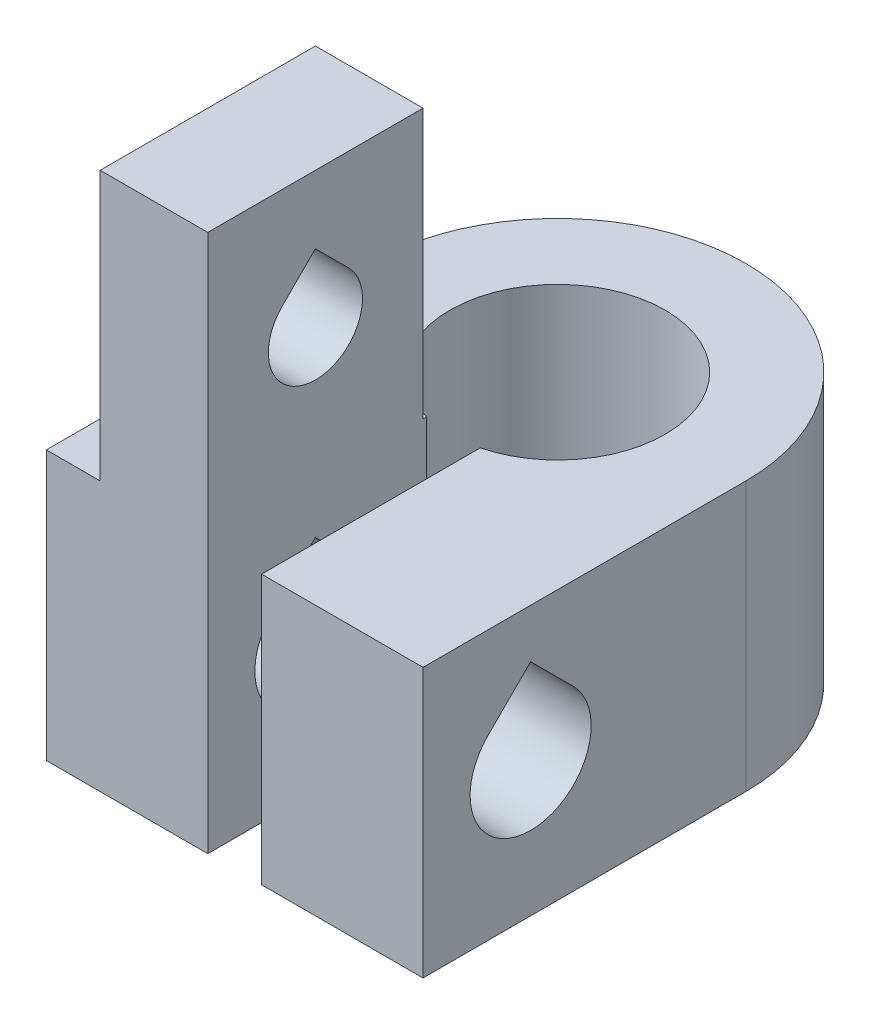
ISO-10303-21;
HEADER;
FILE_DESCRIPTION(('STEP AP214'),'2;1');
FILE_NAME('part.step','',(''),(''),'','','');
FILE_SCHEMA(('AUTOMOTIVE_DESIGN { 1 0 10303 214 1 1 1 1 }'));
ENDSEC;
DATA;
#1=APPLICATION_CONTEXT('core data for automotive mechanical design processes');
#2=APPLICATION_PROTOCOL_DEFINITION('international standard','automotive_design',2000,#1);
#3=PRODUCT_CONTEXT('',#1,'mechanical');
#4=PRODUCT('Part','Part','',(#3));
#5=PRODUCT_RELATED_PRODUCT_CATEGORY('part','',(#4));
#6=PRODUCT_DEFINITION_FORMATION('','',#4);
#7=PRODUCT_DEFINITION_CONTEXT('part definition',#1,'design');
#8=PRODUCT_DEFINITION('design','',#6,#7);
#9=PRODUCT_DEFINITION_SHAPE('','',#8);
#10=(LENGTH_UNIT() NAMED_UNIT(*) SI_UNIT(.MILLI.,.METRE.));
#11=(NAMED_UNIT(*) PLANE_ANGLE_UNIT() SI_UNIT($,.RADIAN.));
#12=(NAMED_UNIT(*) SI_UNIT($,.STERADIAN.) SOLID_ANGLE_UNIT());
#13=UNCERTAINTY_MEASURE_WITH_UNIT(LENGTH_MEASURE(1.E-05),#10,'distance_accuracy_value','');
#14=(GEOMETRIC_REPRESENTATION_CONTEXT(3) GLOBAL_UNCERTAINTY_ASSIGNED_CONTEXT((#13)) GLOBAL_UNIT_ASSIGNED_CONTEXT((#10,
#11,#12)) REPRESENTATION_CONTEXT('',''));
#15=CARTESIAN_POINT('',(0.,0.,0.));
#16=DIRECTION('',(0.,0.,1.));
#17=DIRECTION('',(1.,0.,0.));
#18=AXIS2_PLACEMENT_3D('',#15,#16,#17);
#19=CARTESIAN_POINT('',(-7.,20.,12.));
#20=DIRECTION('',(0.,0.,-1.));
#21=DIRECTION('',(-1.,0.,0.));
#22=AXIS2_PLACEMENT_3D('',#19,#20,#21);
#23=PLANE('',#22);
#24=DIRECTION('',(0.,1.,0.));
#25=VECTOR('',#24,1.);
#26=CARTESIAN_POINT('',(-5.,10.,12.));
#27=LINE('',#26,#25);
#28=CARTESIAN_POINT('',(-5.,10.,12.));
#29=VERTEX_POINT('',#28);
#30=CARTESIAN_POINT('',(-5.,20.,12.));
#31=VERTEX_POINT('',#30);
#32=EDGE_CURVE('E175',#29,#31,#27,.T.);
#33=ORIENTED_EDGE('',*,*,#32,.F.);
#34=DIRECTION('',(-1.,0.,0.));
#35=VECTOR('',#34,1.);
#36=CARTESIAN_POINT('',(-5.,10.,12.));
#37=LINE('',#36,#35);
#38=CARTESIAN_POINT('',(-7.,10.,12.));
#39=VERTEX_POINT('',#38);
#40=EDGE_CURVE('E173',#29,#39,#37,.T.);
#41=ORIENTED_EDGE('',*,*,#40,.T.);
#42=DIRECTION('',(0.,-1.,0.));
#43=VECTOR('',#42,1.);
#44=CARTESIAN_POINT('',(-7.,20.,12.));
#45=LINE('',#44,#43);
#46=CARTESIAN_POINT('',(-7.,0.,12.));
#47=VERTEX_POINT('',#46);
#48=EDGE_CURVE('E261',#39,#47,#45,.T.);
#49=ORIENTED_EDGE('',*,*,#48,.T.);
#50=DIRECTION('',(1.,0.,0.));
#51=VECTOR('',#50,1.);
#52=CARTESIAN_POINT('',(-7.,0.,12.));
#53=LINE('',#52,#51);
#54=CARTESIAN_POINT('',(-1.,0.,12.));
#55=VERTEX_POINT('',#54);
#56=EDGE_CURVE('E254',#47,#55,#53,.T.);
#57=ORIENTED_EDGE('',*,*,#56,.T.);
#58=DIRECTION('',(0.,-1.,0.));
#59=VECTOR('',#58,1.);
#60=CARTESIAN_POINT('',(-1.,20.,12.));
#61=LINE('',#60,#59);
#62=CARTESIAN_POINT('',(-1.,20.,12.));
#63=VERTEX_POINT('',#62);
#64=EDGE_CURVE('E39',#63,#55,#61,.T.);
#65=ORIENTED_EDGE('',*,*,#64,.F.);
#66=DIRECTION('',(1.,0.,0.));
#67=VECTOR('',#66,1.);
#68=CARTESIAN_POINT('',(-7.,20.,12.));
#69=LINE('',#68,#67);
#70=EDGE_CURVE('E255',#31,#63,#69,.T.);
#71=ORIENTED_EDGE('',*,*,#70,.F.);
#72=EDGE_LOOP('',(#33,#41,#49,#57,#65,#71));
#73=FACE_BOUND('',#72,.T.);
#74=ADVANCED_FACE('F32',(#73),#23,.F.);
#75=CARTESIAN_POINT('',(-1.,20.,12.));
#76=DIRECTION('',(-1.,0.,0.));
#77=DIRECTION('',(0.,0.,1.));
#78=AXIS2_PLACEMENT_3D('',#75,#76,#77);
#79=PLANE('',#78);
#80=DIRECTION('',(0.,0.707106781186548,0.707106781186547));
#81=VECTOR('',#80,1.);
#82=CARTESIAN_POINT('',(-1.,17.4748737341529,8.));
#83=LINE('',#82,#81);
#84=CARTESIAN_POINT('',(-1.,16.2374368670765,6.76256313292354));
#85=VERTEX_POINT('',#84);
#86=CARTESIAN_POINT('',(-1.,17.4748737341529,8.));
#87=VERTEX_POINT('',#86);
#88=EDGE_CURVE('E338',#85,#87,#83,.T.);
#89=ORIENTED_EDGE('',*,*,#88,.F.);
#90=CARTESIAN_POINT('',(-1.,15.,8.));
#91=DIRECTION('',(1.,0.,0.));
#92=DIRECTION('',(0.,0.,-1.));
#93=AXIS2_PLACEMENT_3D('',#90,#91,#92);
#94=CIRCLE('',#93,1.75);
#95=CARTESIAN_POINT('',(-1.,16.2374368670765,9.23743686707646));
#96=VERTEX_POINT('',#95);
#97=EDGE_CURVE('E341',#96,#85,#94,.T.);
#98=ORIENTED_EDGE('',*,*,#97,.F.);
#99=DIRECTION('',(0.,-0.707106781186547,0.707106781186548));
#100=VECTOR('',#99,1.);
#101=CARTESIAN_POINT('',(-1.,16.2374368670765,9.23743686707646));
#102=LINE('',#101,#100);
#103=EDGE_CURVE('E333',#87,#96,#102,.T.);
#104=ORIENTED_EDGE('',*,*,#103,.F.);
#105=EDGE_LOOP('',(#89,#98,#104));
#106=FACE_BOUND('',#105,.T.);
#107=DIRECTION('',(0.,-0.707106781186548,-0.707106781186547));
#108=VECTOR('',#107,1.);
#109=CARTESIAN_POINT('',(-1.,16.0909902576697,15.9090097423303));
#110=LINE('',#109,#108);
#111=CARTESIAN_POINT('',(-1.,8.18198051533946,8.));
#112=VERTEX_POINT('',#111);
#113=CARTESIAN_POINT('',(-1.,6.59099025766973,6.40900974233027));
#114=VERTEX_POINT('',#113);
#115=EDGE_CURVE('E245',#112,#114,#110,.T.);
#116=ORIENTED_EDGE('',*,*,#115,.T.);
#117=CARTESIAN_POINT('',(-1.,5.,8.));
#118=DIRECTION('',(-1.,0.,0.));
#119=DIRECTION('',(0.,0.,1.));
#120=AXIS2_PLACEMENT_3D('',#117,#118,#119);
#121=CIRCLE('',#120,2.25);
#122=CARTESIAN_POINT('',(-1.,6.59099025766973,9.59099025766973));
#123=VERTEX_POINT('',#122);
#124=EDGE_CURVE('E251',#114,#123,#121,.T.);
#125=ORIENTED_EDGE('',*,*,#124,.T.);
#126=DIRECTION('',(0.,0.707106781186548,-0.707106781186547));
#127=VECTOR('',#126,1.);
#128=CARTESIAN_POINT('',(-1.,12.0909902576697,4.09099025766973));
#129=LINE('',#128,#127);
#130=EDGE_CURVE('E239',#123,#112,#129,.T.);
#131=ORIENTED_EDGE('',*,*,#130,.T.);
#132=EDGE_LOOP('',(#116,#125,#131));
#133=FACE_BOUND('',#132,.T.);
#134=DIRECTION('',(0.,0.,1.));
#135=VECTOR('',#134,1.);
#136=CARTESIAN_POINT('',(-1.,10.,12.));
#137=LINE('',#136,#135);
#138=CARTESIAN_POINT('',(-1.,10.,3.87298334620742));
#139=VERTEX_POINT('',#138);
#140=CARTESIAN_POINT('',(-1.,10.,4.));
#141=VERTEX_POINT('',#140);
#142=EDGE_CURVE('E206',#139,#141,#137,.T.);
#143=ORIENTED_EDGE('',*,*,#142,.T.);
#144=DIRECTION('',(0.,1.,0.));
#145=VECTOR('',#144,1.);
#146=CARTESIAN_POINT('',(-1.,20.,4.));
#147=LINE('',#146,#145);
#148=CARTESIAN_POINT('',(-1.,20.,4.));
#149=VERTEX_POINT('',#148);
#150=EDGE_CURVE('E184',#141,#149,#147,.T.);
#151=ORIENTED_EDGE('',*,*,#150,.T.);
#152=DIRECTION('',(0.,0.,-1.));
#153=VECTOR('',#152,1.);
#154=CARTESIAN_POINT('',(-1.,20.,12.));
#155=LINE('',#154,#153);
#156=EDGE_CURVE('E257',#63,#149,#155,.T.);
#157=ORIENTED_EDGE('',*,*,#156,.F.);
#158=ORIENTED_EDGE('',*,*,#64,.T.);
#159=DIRECTION('',(0.,0.,-1.));
#160=VECTOR('',#159,1.);
#161=CARTESIAN_POINT('',(-1.,0.,12.));
#162=LINE('',#161,#160);
#163=CARTESIAN_POINT('',(-1.,0.,3.87298334620742));
#164=VERTEX_POINT('',#163);
#165=EDGE_CURVE('E264',#55,#164,#162,.T.);
#166=ORIENTED_EDGE('',*,*,#165,.T.);
#167=DIRECTION('',(0.,-1.,0.));
#168=VECTOR('',#167,1.);
#169=CARTESIAN_POINT('',(-1.,20.,3.87298334620742));
#170=LINE('',#169,#168);
#171=EDGE_CURVE('E295',#139,#164,#170,.T.);
#172=ORIENTED_EDGE('',*,*,#171,.F.);
#173=EDGE_LOOP('',(#143,#151,#157,#158,#166,#172));
#174=FACE_BOUND('',#173,.T.);
#175=ADVANCED_FACE('F300',(#106,#133,#174),#79,.F.);
#176=CARTESIAN_POINT('',(0.,20.,0.));
#177=DIRECTION('',(0.,-1.,0.));
#178=DIRECTION('',(0.,0.,-1.));
#179=AXIS2_PLACEMENT_3D('',#176,#177,#178);
#180=CYLINDRICAL_SURFACE('',#179,4.);
#181=DIRECTION('',(0.,-1.,0.));
#182=VECTOR('',#181,1.);
#183=CARTESIAN_POINT('',(1.,20.,3.87298334620742));
#184=LINE('',#183,#182);
#185=CARTESIAN_POINT('',(1.,10.,3.87298334620742));
#186=VERTEX_POINT('',#185);
#187=CARTESIAN_POINT('',(1.,0.,3.87298334620742));
#188=VERTEX_POINT('',#187);
#189=EDGE_CURVE('E293',#186,#188,#184,.T.);
#190=ORIENTED_EDGE('',*,*,#189,.F.);
#191=CARTESIAN_POINT('',(0.,10.,0.));
#192=DIRECTION('',(0.,-1.,0.));
#193=DIRECTION('',(0.,0.,-1.));
#194=AXIS2_PLACEMENT_3D('',#191,#192,#193);
#195=CIRCLE('',#194,4.);
#196=EDGE_CURVE('E203',#186,#139,#195,.F.);
#197=ORIENTED_EDGE('',*,*,#196,.T.);
#198=ORIENTED_EDGE('',*,*,#171,.T.);
#199=CARTESIAN_POINT('',(0.,0.,0.));
#200=DIRECTION('',(0.,-1.,0.));
#201=DIRECTION('',(0.,0.,1.));
#202=AXIS2_PLACEMENT_3D('',#199,#200,#201);
#203=CIRCLE('',#202,4.);
#204=EDGE_CURVE('E267',#164,#188,#203,.T.);
#205=ORIENTED_EDGE('',*,*,#204,.T.);
#206=EDGE_LOOP('',(#190,#197,#198,#205));
#207=FACE_BOUND('',#206,.T.);
#208=ADVANCED_FACE('F315',(#207),#180,.F.);
#209=CARTESIAN_POINT('',(1.,20.,12.));
#210=DIRECTION('',(1.,0.,0.));
#211=DIRECTION('',(0.,0.,-1.));
#212=AXIS2_PLACEMENT_3D('',#209,#210,#211);
#213=PLANE('',#212);
#214=DIRECTION('',(0.,-0.707106781186548,0.707106781186547));
#215=VECTOR('',#214,1.);
#216=CARTESIAN_POINT('',(1.,12.0909902576697,4.09099025766973));
#217=LINE('',#216,#215);
#218=CARTESIAN_POINT('',(1.,8.18198051533946,8.));
#219=VERTEX_POINT('',#218);
#220=CARTESIAN_POINT('',(1.,6.59099025766973,9.59099025766973));
#221=VERTEX_POINT('',#220);
#222=EDGE_CURVE('E229',#219,#221,#217,.T.);
#223=ORIENTED_EDGE('',*,*,#222,.T.);
#224=CARTESIAN_POINT('',(1.,5.,8.));
#225=DIRECTION('',(1.,0.,0.));
#226=DIRECTION('',(0.,0.,-1.));
#227=AXIS2_PLACEMENT_3D('',#224,#225,#226);
#228=CIRCLE('',#227,2.25);
#229=CARTESIAN_POINT('',(1.,6.59099025766973,6.40900974233027));
#230=VERTEX_POINT('',#229);
#231=EDGE_CURVE('E248',#221,#230,#228,.T.);
#232=ORIENTED_EDGE('',*,*,#231,.T.);
#233=DIRECTION('',(0.,0.707106781186548,0.707106781186547));
#234=VECTOR('',#233,1.);
#235=CARTESIAN_POINT('',(1.,16.0909902576697,15.9090097423303));
#236=LINE('',#235,#234);
#237=EDGE_CURVE('E242',#230,#219,#236,.T.);
#238=ORIENTED_EDGE('',*,*,#237,.T.);
#239=EDGE_LOOP('',(#223,#232,#238));
#240=FACE_BOUND('',#239,.T.);
#241=DIRECTION('',(0.,-1.,0.));
#242=VECTOR('',#241,1.);
#243=CARTESIAN_POINT('',(1.,20.,12.));
#244=LINE('',#243,#242);
#245=CARTESIAN_POINT('',(1.,10.,12.));
#246=VERTEX_POINT('',#245);
#247=CARTESIAN_POINT('',(1.,0.,12.));
#248=VERTEX_POINT('',#247);
#249=EDGE_CURVE('E291',#246,#248,#244,.T.);
#250=ORIENTED_EDGE('',*,*,#249,.F.);
#251=DIRECTION('',(0.,0.,-1.));
#252=VECTOR('',#251,1.);
#253=CARTESIAN_POINT('',(1.,10.,12.));
#254=LINE('',#253,#252);
#255=EDGE_CURVE('E200',#246,#186,#254,.T.);
#256=ORIENTED_EDGE('',*,*,#255,.T.);
#257=ORIENTED_EDGE('',*,*,#189,.T.);
#258=DIRECTION('',(0.,0.,1.));
#259=VECTOR('',#258,1.);
#260=CARTESIAN_POINT('',(1.,0.,12.));
#261=LINE('',#260,#259);
#262=EDGE_CURVE('E270',#188,#248,#261,.T.);
#263=ORIENTED_EDGE('',*,*,#262,.T.);
#264=EDGE_LOOP('',(#250,#256,#257,#263));
#265=FACE_BOUND('',#264,.T.);
#266=ADVANCED_FACE('F319',(#240,#265),#213,.F.);
#267=CARTESIAN_POINT('',(7.,20.,12.));
#268=DIRECTION('',(0.,0.,-1.));
#269=DIRECTION('',(-1.,0.,0.));
#270=AXIS2_PLACEMENT_3D('',#267,#268,#269);
#271=PLANE('',#270);
#272=DIRECTION('',(0.,-1.,0.));
#273=VECTOR('',#272,1.);
#274=CARTESIAN_POINT('',(7.,20.,12.));
#275=LINE('',#274,#273);
#276=CARTESIAN_POINT('',(7.,10.,12.));
#277=VERTEX_POINT('',#276);
#278=CARTESIAN_POINT('',(7.,0.,12.));
#279=VERTEX_POINT('',#278);
#280=EDGE_CURVE('E289',#277,#279,#275,.T.);
#281=ORIENTED_EDGE('',*,*,#280,.F.);
#282=DIRECTION('',(1.,0.,0.));
#283=VECTOR('',#282,1.);
#284=CARTESIAN_POINT('',(7.,10.,12.));
#285=LINE('',#284,#283);
#286=EDGE_CURVE('E186',#246,#277,#285,.T.);
#287=ORIENTED_EDGE('',*,*,#286,.F.);
#288=ORIENTED_EDGE('',*,*,#249,.T.);
#289=DIRECTION('',(1.,0.,0.));
#290=VECTOR('',#289,1.);
#291=CARTESIAN_POINT('',(7.,0.,12.));
#292=LINE('',#291,#290);
#293=EDGE_CURVE('E273',#248,#279,#292,.T.);
#294=ORIENTED_EDGE('',*,*,#293,.T.);
#295=EDGE_LOOP('',(#281,#287,#288,#294));
#296=FACE_BOUND('',#295,.T.);
#297=ADVANCED_FACE('F322',(#296),#271,.F.);
#298=CARTESIAN_POINT('',(7.,20.,0.));
#299=DIRECTION('',(-1.,0.,0.));
#300=DIRECTION('',(0.,0.,1.));
#301=AXIS2_PLACEMENT_3D('',#298,#299,#300);
#302=PLANE('',#301);
#303=DIRECTION('',(0.,-0.707106781186548,-0.707106781186547));
#304=VECTOR('',#303,1.);
#305=CARTESIAN_POINT('',(7.,6.59099025766973,6.40900974233027));
#306=LINE('',#305,#304);
#307=CARTESIAN_POINT('',(7.,8.18198051533946,8.));
#308=VERTEX_POINT('',#307);
#309=CARTESIAN_POINT('',(7.,6.59099025766973,6.40900974233027));
#310=VERTEX_POINT('',#309);
#311=EDGE_CURVE('E216',#308,#310,#306,.T.);
#312=ORIENTED_EDGE('',*,*,#311,.T.);
#313=CARTESIAN_POINT('',(7.,5.,8.));
#314=DIRECTION('',(-1.,0.,0.));
#315=DIRECTION('',(0.,0.,1.));
#316=AXIS2_PLACEMENT_3D('',#313,#314,#315);
#317=CIRCLE('',#316,2.25);
#318=CARTESIAN_POINT('',(7.,6.59099025766973,9.59099025766973));
#319=VERTEX_POINT('',#318);
#320=EDGE_CURVE('E209',#310,#319,#317,.T.);
#321=ORIENTED_EDGE('',*,*,#320,.T.);
#322=DIRECTION('',(0.,0.707106781186548,-0.707106781186547));
#323=VECTOR('',#322,1.);
#324=CARTESIAN_POINT('',(7.,8.18198051533946,8.));
#325=LINE('',#324,#323);
#326=EDGE_CURVE('E212',#319,#308,#325,.T.);
#327=ORIENTED_EDGE('',*,*,#326,.T.);
#328=EDGE_LOOP('',(#312,#321,#327));
#329=FACE_BOUND('',#328,.T.);
#330=DIRECTION('',(0.,-1.,0.));
#331=VECTOR('',#330,1.);
#332=CARTESIAN_POINT('',(7.,20.,0.));
#333=LINE('',#332,#331);
#334=CARTESIAN_POINT('',(7.,10.,0.));
#335=VERTEX_POINT('',#334);
#336=CARTESIAN_POINT('',(7.,0.,0.));
#337=VERTEX_POINT('',#336);
#338=EDGE_CURVE('E287',#335,#337,#333,.T.);
#339=ORIENTED_EDGE('',*,*,#338,.F.);
#340=DIRECTION('',(0.,0.,-1.));
#341=VECTOR('',#340,1.);
#342=CARTESIAN_POINT('',(7.,10.,12.));
#343=LINE('',#342,#341);
#344=EDGE_CURVE('E190',#277,#335,#343,.T.);
#345=ORIENTED_EDGE('',*,*,#344,.F.);
#346=ORIENTED_EDGE('',*,*,#280,.T.);
#347=DIRECTION('',(0.,0.,-1.));
#348=VECTOR('',#347,1.);
#349=CARTESIAN_POINT('',(7.,0.,0.));
#350=LINE('',#349,#348);
#351=EDGE_CURVE('E276',#279,#337,#350,.T.);
#352=ORIENTED_EDGE('',*,*,#351,.T.);
#353=EDGE_LOOP('',(#339,#345,#346,#352));
#354=FACE_BOUND('',#353,.T.);
#355=ADVANCED_FACE('F328',(#329,#354),#302,.F.);
#356=CARTESIAN_POINT('',(0.,20.,0.));
#357=DIRECTION('',(0.,-1.,0.));
#358=DIRECTION('',(0.,0.,-1.));
#359=AXIS2_PLACEMENT_3D('',#356,#357,#358);
#360=CYLINDRICAL_SURFACE('',#359,7.);
#361=CARTESIAN_POINT('',(0.,10.,0.));
#362=DIRECTION('',(0.,-1.,0.));
#363=DIRECTION('',(0.,0.,-1.));
#364=AXIS2_PLACEMENT_3D('',#361,#362,#363);
#365=CIRCLE('',#364,7.);
#366=CARTESIAN_POINT('',(-7.,10.,0.));
#367=VERTEX_POINT('',#366);
#368=EDGE_CURVE('E198',#367,#335,#365,.T.);
#369=ORIENTED_EDGE('',*,*,#368,.T.);
#370=ORIENTED_EDGE('',*,*,#338,.T.);
#371=CARTESIAN_POINT('',(0.,0.,0.));
#372=DIRECTION('',(0.,1.,0.));
#373=DIRECTION('',(0.,0.,-1.));
#374=AXIS2_PLACEMENT_3D('',#371,#372,#373);
#375=CIRCLE('',#374,7.);
#376=CARTESIAN_POINT('',(-7.,0.,0.));
#377=VERTEX_POINT('',#376);
#378=EDGE_CURVE('E279',#337,#377,#375,.T.);
#379=ORIENTED_EDGE('',*,*,#378,.T.);
#380=DIRECTION('',(0.,-1.,0.));
#381=VECTOR('',#380,1.);
#382=CARTESIAN_POINT('',(-7.,20.,0.));
#383=LINE('',#382,#381);
#384=EDGE_CURVE('E285',#367,#377,#383,.T.);
#385=ORIENTED_EDGE('',*,*,#384,.F.);
#386=EDGE_LOOP('',(#369,#370,#379,#385));
#387=FACE_BOUND('',#386,.T.);
#388=ADVANCED_FACE('F361',(#387),#360,.T.);
#389=CARTESIAN_POINT('',(-7.,20.,12.));
#390=DIRECTION('',(1.,0.,0.));
#391=DIRECTION('',(0.,0.,-1.));
#392=AXIS2_PLACEMENT_3D('',#389,#390,#391);
#393=PLANE('',#392);
#394=DIRECTION('',(0.,0.707106781186548,-0.707106781186547));
#395=VECTOR('',#394,1.);
#396=CARTESIAN_POINT('',(-7.,8.18198051533946,8.));
#397=LINE('',#396,#395);
#398=CARTESIAN_POINT('',(-7.,6.59099025766973,9.59099025766973));
#399=VERTEX_POINT('',#398);
#400=CARTESIAN_POINT('',(-7.,8.18198051533946,8.));
#401=VERTEX_POINT('',#400);
#402=EDGE_CURVE('E221',#399,#401,#397,.T.);
#403=ORIENTED_EDGE('',*,*,#402,.F.);
#404=CARTESIAN_POINT('',(-7.,5.,8.));
#405=DIRECTION('',(-1.,0.,0.));
#406=DIRECTION('',(0.,0.,1.));
#407=AXIS2_PLACEMENT_3D('',#404,#405,#406);
#408=CIRCLE('',#407,2.25);
#409=CARTESIAN_POINT('',(-7.,6.59099025766973,6.40900974233027));
#410=VERTEX_POINT('',#409);
#411=EDGE_CURVE('E208',#410,#399,#408,.T.);
#412=ORIENTED_EDGE('',*,*,#411,.F.);
#413=DIRECTION('',(0.,-0.707106781186548,-0.707106781186547));
#414=VECTOR('',#413,1.);
#415=CARTESIAN_POINT('',(-7.,6.59099025766973,6.40900974233027));
#416=LINE('',#415,#414);
#417=EDGE_CURVE('E213',#401,#410,#416,.T.);
#418=ORIENTED_EDGE('',*,*,#417,.F.);
#419=EDGE_LOOP('',(#403,#412,#418));
#420=FACE_BOUND('',#419,.T.);
#421=ORIENTED_EDGE('',*,*,#48,.F.);
#422=DIRECTION('',(0.,0.,1.));
#423=VECTOR('',#422,1.);
#424=CARTESIAN_POINT('',(-7.,10.,4.));
#425=LINE('',#424,#423);
#426=EDGE_CURVE('E187',#367,#39,#425,.T.);
#427=ORIENTED_EDGE('',*,*,#426,.F.);
#428=ORIENTED_EDGE('',*,*,#384,.T.);
#429=DIRECTION('',(0.,0.,1.));
#430=VECTOR('',#429,1.);
#431=CARTESIAN_POINT('',(-7.,0.,12.));
#432=LINE('',#431,#430);
#433=EDGE_CURVE('E258',#377,#47,#432,.T.);
#434=ORIENTED_EDGE('',*,*,#433,.T.);
#435=EDGE_LOOP('',(#421,#427,#428,#434));
#436=FACE_BOUND('',#435,.T.);
#437=ADVANCED_FACE('F353',(#420,#436),#393,.F.);
#438=CARTESIAN_POINT('',(0.,20.,0.));
#439=DIRECTION('',(0.,1.,0.));
#440=DIRECTION('',(0.,0.,1.));
#441=AXIS2_PLACEMENT_3D('',#438,#439,#440);
#442=PLANE('',#441);
#443=DIRECTION('',(0.,0.,-1.));
#444=VECTOR('',#443,1.);
#445=CARTESIAN_POINT('',(-5.,20.,4.));
#446=LINE('',#445,#444);
#447=CARTESIAN_POINT('',(-5.,20.,4.));
#448=VERTEX_POINT('',#447);
#449=EDGE_CURVE('E46',#31,#448,#446,.T.);
#450=ORIENTED_EDGE('',*,*,#449,.F.);
#451=ORIENTED_EDGE('',*,*,#70,.T.);
#452=ORIENTED_EDGE('',*,*,#156,.T.);
#453=DIRECTION('',(1.,0.,0.));
#454=VECTOR('',#453,1.);
#455=CARTESIAN_POINT('',(1.,20.,4.));
#456=LINE('',#455,#454);
#457=EDGE_CURVE('E194',#448,#149,#456,.T.);
#458=ORIENTED_EDGE('',*,*,#457,.F.);
#459=EDGE_LOOP('',(#450,#451,#452,#458));
#460=FACE_BOUND('',#459,.T.);
#461=ADVANCED_FACE('F351',(#460),#442,.T.);
#462=CARTESIAN_POINT('',(0.,0.,0.));
#463=DIRECTION('',(0.,1.,0.));
#464=DIRECTION('',(0.,0.,1.));
#465=AXIS2_PLACEMENT_3D('',#462,#463,#464);
#466=PLANE('',#465);
#467=ORIENTED_EDGE('',*,*,#56,.F.);
#468=ORIENTED_EDGE('',*,*,#433,.F.);
#469=ORIENTED_EDGE('',*,*,#378,.F.);
#470=ORIENTED_EDGE('',*,*,#351,.F.);
#471=ORIENTED_EDGE('',*,*,#293,.F.);
#472=ORIENTED_EDGE('',*,*,#262,.F.);
#473=ORIENTED_EDGE('',*,*,#204,.F.);
#474=ORIENTED_EDGE('',*,*,#165,.F.);
#475=EDGE_LOOP('',(#467,#468,#469,#470,#471,#472,#473,#474));
#476=FACE_BOUND('',#475,.T.);
#477=ADVANCED_FACE('F309',(#476),#466,.F.);
#478=CARTESIAN_POINT('',(7.,8.18198051533946,8.));
#479=DIRECTION('',(0.,0.707106781186547,0.707106781186548));
#480=DIRECTION('',(0.,-0.707106781186548,0.707106781186547));
#481=AXIS2_PLACEMENT_3D('',#478,#479,#480);
#482=PLANE('',#481);
#483=DIRECTION('',(-1.,0.,0.));
#484=VECTOR('',#483,1.);
#485=CARTESIAN_POINT('',(7.,6.59099025766973,9.59099025766973));
#486=LINE('',#485,#484);
#487=EDGE_CURVE('E219',#123,#399,#486,.T.);
#488=ORIENTED_EDGE('',*,*,#487,.T.);
#489=ORIENTED_EDGE('',*,*,#402,.T.);
#490=DIRECTION('',(-1.,0.,0.));
#491=VECTOR('',#490,1.);
#492=CARTESIAN_POINT('',(7.,8.18198051533946,8.));
#493=LINE('',#492,#491);
#494=EDGE_CURVE('E234',#112,#401,#493,.T.);
#495=ORIENTED_EDGE('',*,*,#494,.F.);
#496=ORIENTED_EDGE('',*,*,#130,.F.);
#497=EDGE_LOOP('',(#488,#489,#495,#496));
#498=FACE_BOUND('',#497,.T.);
#499=ADVANCED_FACE('F359',(#498),#482,.F.);
#500=CARTESIAN_POINT('',(7.,6.59099025766973,6.40900974233027));
#501=DIRECTION('',(0.,0.707106781186547,-0.707106781186548));
#502=DIRECTION('',(0.,0.707106781186548,0.707106781186547));
#503=AXIS2_PLACEMENT_3D('',#500,#501,#502);
#504=PLANE('',#503);
#505=ORIENTED_EDGE('',*,*,#494,.T.);
#506=ORIENTED_EDGE('',*,*,#417,.T.);
#507=DIRECTION('',(-1.,0.,0.));
#508=VECTOR('',#507,1.);
#509=CARTESIAN_POINT('',(7.,6.59099025766973,6.40900974233027));
#510=LINE('',#509,#508);
#511=EDGE_CURVE('E230',#114,#410,#510,.T.);
#512=ORIENTED_EDGE('',*,*,#511,.F.);
#513=ORIENTED_EDGE('',*,*,#115,.F.);
#514=EDGE_LOOP('',(#505,#506,#512,#513));
#515=FACE_BOUND('',#514,.T.);
#516=ADVANCED_FACE('F467',(#515),#504,.F.);
#517=CARTESIAN_POINT('',(7.,5.,8.));
#518=DIRECTION('',(-1.,0.,0.));
#519=DIRECTION('',(0.,0.,1.));
#520=AXIS2_PLACEMENT_3D('',#517,#518,#519);
#521=CYLINDRICAL_SURFACE('',#520,2.25);
#522=ORIENTED_EDGE('',*,*,#511,.T.);
#523=ORIENTED_EDGE('',*,*,#411,.T.);
#524=ORIENTED_EDGE('',*,*,#487,.F.);
#525=ORIENTED_EDGE('',*,*,#124,.F.);
#526=EDGE_LOOP('',(#522,#523,#524,#525));
#527=FACE_BOUND('',#526,.T.);
#528=ADVANCED_FACE('F470',(#527),#521,.F.);
#529=EDGE_CURVE('E235',#319,#221,#486,.T.);
#530=ORIENTED_EDGE('',*,*,#529,.F.);
#531=ORIENTED_EDGE('',*,*,#320,.F.);
#532=EDGE_CURVE('E226',#310,#230,#510,.T.);
#533=ORIENTED_EDGE('',*,*,#532,.T.);
#534=ORIENTED_EDGE('',*,*,#231,.F.);
#535=EDGE_LOOP('',(#530,#531,#533,#534));
#536=FACE_BOUND('',#535,.T.);
#537=ADVANCED_FACE('F476',(#536),#521,.F.);
#538=ORIENTED_EDGE('',*,*,#532,.F.);
#539=ORIENTED_EDGE('',*,*,#311,.F.);
#540=EDGE_CURVE('E231',#308,#219,#493,.T.);
#541=ORIENTED_EDGE('',*,*,#540,.T.);
#542=ORIENTED_EDGE('',*,*,#237,.F.);
#543=EDGE_LOOP('',(#538,#539,#541,#542));
#544=FACE_BOUND('',#543,.T.);
#545=ADVANCED_FACE('F472',(#544),#504,.F.);
#546=ORIENTED_EDGE('',*,*,#540,.F.);
#547=ORIENTED_EDGE('',*,*,#326,.F.);
#548=ORIENTED_EDGE('',*,*,#529,.T.);
#549=ORIENTED_EDGE('',*,*,#222,.F.);
#550=EDGE_LOOP('',(#546,#547,#548,#549));
#551=FACE_BOUND('',#550,.T.);
#552=ADVANCED_FACE('F414',(#551),#482,.F.);
#553=CARTESIAN_POINT('',(0.,10.,0.));
#554=DIRECTION('',(0.,-1.,0.));
#555=DIRECTION('',(0.,0.,-1.));
#556=AXIS2_PLACEMENT_3D('',#553,#554,#555);
#557=PLANE('',#556);
#558=ORIENTED_EDGE('',*,*,#196,.F.);
#559=ORIENTED_EDGE('',*,*,#255,.F.);
#560=ORIENTED_EDGE('',*,*,#286,.T.);
#561=ORIENTED_EDGE('',*,*,#344,.T.);
#562=ORIENTED_EDGE('',*,*,#368,.F.);
#563=ORIENTED_EDGE('',*,*,#426,.T.);
#564=ORIENTED_EDGE('',*,*,#40,.F.);
#565=DIRECTION('',(0.,0.,1.));
#566=VECTOR('',#565,1.);
#567=CARTESIAN_POINT('',(-5.,10.,4.));
#568=LINE('',#567,#566);
#569=CARTESIAN_POINT('',(-5.,10.,4.));
#570=VERTEX_POINT('',#569);
#571=EDGE_CURVE('E167',#570,#29,#568,.T.);
#572=ORIENTED_EDGE('',*,*,#571,.F.);
#573=DIRECTION('',(1.,0.,0.));
#574=VECTOR('',#573,1.);
#575=CARTESIAN_POINT('',(1.,10.,4.));
#576=LINE('',#575,#574);
#577=EDGE_CURVE('E170',#570,#141,#576,.T.);
#578=ORIENTED_EDGE('',*,*,#577,.T.);
#579=ORIENTED_EDGE('',*,*,#142,.F.);
#580=EDGE_LOOP('',(#558,#559,#560,#561,#562,#563,#564,#572,#578,#579));
#581=FACE_BOUND('',#580,.T.);
#582=ADVANCED_FACE('F168',(#581),#557,.F.);
#583=CARTESIAN_POINT('',(1.,10.,4.));
#584=DIRECTION('',(0.,0.,1.));
#585=DIRECTION('',(1.,0.,0.));
#586=AXIS2_PLACEMENT_3D('',#583,#584,#585);
#587=PLANE('',#586);
#588=ORIENTED_EDGE('',*,*,#577,.F.);
#589=DIRECTION('',(0.,-1.,0.));
#590=VECTOR('',#589,1.);
#591=CARTESIAN_POINT('',(-5.,10.,4.));
#592=LINE('',#591,#590);
#593=EDGE_CURVE('E176',#448,#570,#592,.T.);
#594=ORIENTED_EDGE('',*,*,#593,.F.);
#595=ORIENTED_EDGE('',*,*,#457,.T.);
#596=ORIENTED_EDGE('',*,*,#150,.F.);
#597=EDGE_LOOP('',(#588,#594,#595,#596));
#598=FACE_BOUND('',#597,.T.);
#599=ADVANCED_FACE('F182',(#598),#587,.F.);
#600=CARTESIAN_POINT('',(-11.,15.,8.));
#601=DIRECTION('',(1.,0.,0.));
#602=DIRECTION('',(0.,0.,-1.));
#603=AXIS2_PLACEMENT_3D('',#600,#601,#602);
#604=CYLINDRICAL_SURFACE('',#603,1.75);
#605=DIRECTION('',(1.,0.,0.));
#606=VECTOR('',#605,1.);
#607=CARTESIAN_POINT('',(-11.,16.2374368670765,6.76256313292354));
#608=LINE('',#607,#606);
#609=CARTESIAN_POINT('',(-5.,16.2374368670765,6.76256313292354));
#610=VERTEX_POINT('',#609);
#611=EDGE_CURVE('E330',#610,#85,#608,.T.);
#612=ORIENTED_EDGE('',*,*,#611,.F.);
#613=CARTESIAN_POINT('',(-5.,15.,8.));
#614=DIRECTION('',(1.,0.,0.));
#615=DIRECTION('',(0.,0.,-1.));
#616=AXIS2_PLACEMENT_3D('',#613,#614,#615);
#617=CIRCLE('',#616,1.75);
#618=CARTESIAN_POINT('',(-5.,16.2374368670765,9.23743686707646));
#619=VERTEX_POINT('',#618);
#620=EDGE_CURVE('E54',#610,#619,#617,.F.);
#621=ORIENTED_EDGE('',*,*,#620,.T.);
#622=DIRECTION('',(1.,0.,0.));
#623=VECTOR('',#622,1.);
#624=CARTESIAN_POINT('',(-11.,16.2374368670765,9.23743686707646));
#625=LINE('',#624,#623);
#626=EDGE_CURVE('E196',#619,#96,#625,.T.);
#627=ORIENTED_EDGE('',*,*,#626,.T.);
#628=ORIENTED_EDGE('',*,*,#97,.T.);
#629=EDGE_LOOP('',(#612,#621,#627,#628));
#630=FACE_BOUND('',#629,.T.);
#631=ADVANCED_FACE('F427',(#630),#604,.F.);
#632=CARTESIAN_POINT('',(-11.,16.2374368670765,9.23743686707646));
#633=DIRECTION('',(0.,0.707106781186548,0.707106781186547));
#634=DIRECTION('',(0.,-0.707106781186547,0.707106781186548));
#635=AXIS2_PLACEMENT_3D('',#632,#633,#634);
#636=PLANE('',#635);
#637=ORIENTED_EDGE('',*,*,#626,.F.);
#638=DIRECTION('',(0.,0.707106781186547,-0.707106781186548));
#639=VECTOR('',#638,1.);
#640=CARTESIAN_POINT('',(-5.,16.2374368670765,9.23743686707646));
#641=LINE('',#640,#639);
#642=CARTESIAN_POINT('',(-5.,17.4748737341529,8.));
#643=VERTEX_POINT('',#642);
#644=EDGE_CURVE('E345',#619,#643,#641,.T.);
#645=ORIENTED_EDGE('',*,*,#644,.T.);
#646=DIRECTION('',(1.,0.,0.));
#647=VECTOR('',#646,1.);
#648=CARTESIAN_POINT('',(-11.,17.4748737341529,8.));
#649=LINE('',#648,#647);
#650=EDGE_CURVE('E332',#643,#87,#649,.T.);
#651=ORIENTED_EDGE('',*,*,#650,.T.);
#652=ORIENTED_EDGE('',*,*,#103,.T.);
#653=EDGE_LOOP('',(#637,#645,#651,#652));
#654=FACE_BOUND('',#653,.T.);
#655=ADVANCED_FACE('F436',(#654),#636,.F.);
#656=CARTESIAN_POINT('',(-11.,17.4748737341529,8.));
#657=DIRECTION('',(0.,0.707106781186547,-0.707106781186548));
#658=DIRECTION('',(0.,0.707106781186548,0.707106781186547));
#659=AXIS2_PLACEMENT_3D('',#656,#657,#658);
#660=PLANE('',#659);
#661=ORIENTED_EDGE('',*,*,#650,.F.);
#662=DIRECTION('',(0.,-0.707106781186548,-0.707106781186547));
#663=VECTOR('',#662,1.);
#664=CARTESIAN_POINT('',(-5.,17.4748737341529,8.));
#665=LINE('',#664,#663);
#666=EDGE_CURVE('E11',#643,#610,#665,.T.);
#667=ORIENTED_EDGE('',*,*,#666,.T.);
#668=ORIENTED_EDGE('',*,*,#611,.T.);
#669=ORIENTED_EDGE('',*,*,#88,.T.);
#670=EDGE_LOOP('',(#661,#667,#668,#669));
#671=FACE_BOUND('',#670,.T.);
#672=ADVANCED_FACE('F446',(#671),#660,.F.);
#673=CARTESIAN_POINT('',(-5.,0.,0.));
#674=DIRECTION('',(1.,0.,0.));
#675=DIRECTION('',(0.,0.,-1.));
#676=AXIS2_PLACEMENT_3D('',#673,#674,#675);
#677=PLANE('',#676);
#678=ORIENTED_EDGE('',*,*,#593,.T.);
#679=ORIENTED_EDGE('',*,*,#571,.T.);
#680=ORIENTED_EDGE('',*,*,#32,.T.);
#681=ORIENTED_EDGE('',*,*,#449,.T.);
#682=EDGE_LOOP('',(#678,#679,#680,#681));
#683=FACE_BOUND('',#682,.T.);
#684=ORIENTED_EDGE('',*,*,#666,.F.);
#685=ORIENTED_EDGE('',*,*,#644,.F.);
#686=ORIENTED_EDGE('',*,*,#620,.F.);
#687=EDGE_LOOP('',(#684,#685,#686));
#688=FACE_BOUND('',#687,.T.);
#689=ADVANCED_FACE('F178',(#683,#688),#677,.F.);
#690=CLOSED_SHELL('',(#74,#175,#208,#266,#297,#355,#388,#437,#461,#477,#499,#516,#528,#537,#545,
#552,#582,#599,#631,#655,#672,#689));
#691=MANIFOLD_SOLID_BREP('B2',#690);
#692=ADVANCED_BREP_SHAPE_REPRESENTATION('',(#18,#691),#14);
#693=SHAPE_DEFINITION_REPRESENTATION(#9,#692);
ENDSEC;
END-ISO-10303-21;
